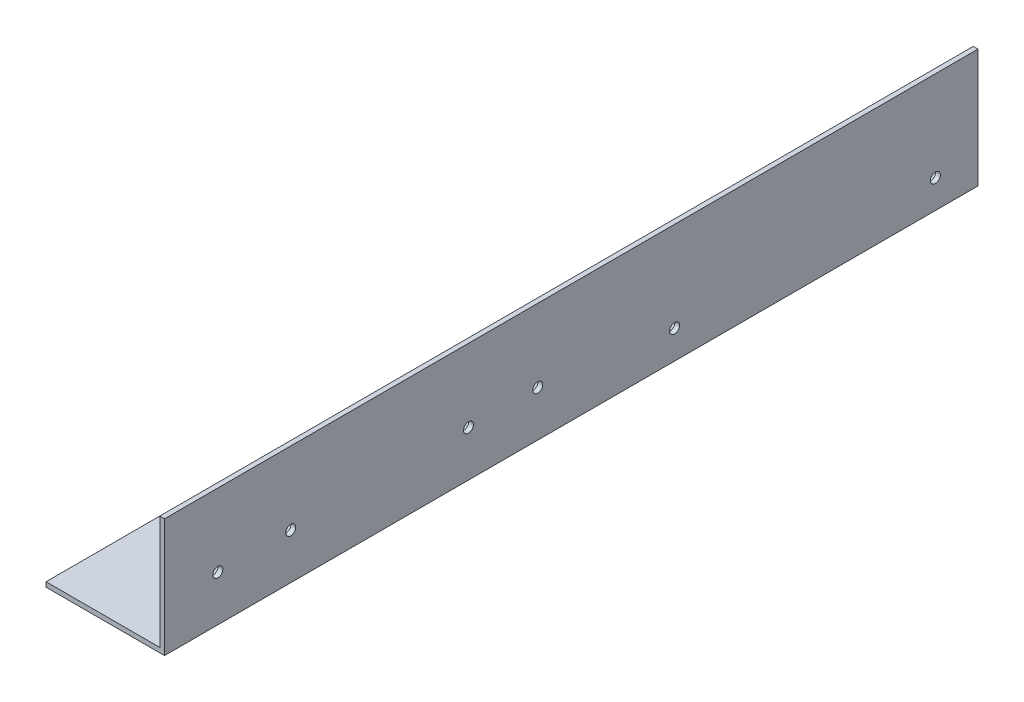
ISO-10303-21;
HEADER;
FILE_DESCRIPTION(('STEP AP214'),'2;1');
FILE_NAME('part.step','',(''),(''),'','','');
FILE_SCHEMA(('AUTOMOTIVE_DESIGN { 1 0 10303 214 1 1 1 1 }'));
ENDSEC;
DATA;
#1=APPLICATION_CONTEXT('core data for automotive mechanical design processes');
#2=APPLICATION_PROTOCOL_DEFINITION('international standard','automotive_design',2000,#1);
#3=PRODUCT_CONTEXT('',#1,'mechanical');
#4=PRODUCT('Part','Part','',(#3));
#5=PRODUCT_RELATED_PRODUCT_CATEGORY('part','',(#4));
#6=PRODUCT_DEFINITION_FORMATION('','',#4);
#7=PRODUCT_DEFINITION_CONTEXT('part definition',#1,'design');
#8=PRODUCT_DEFINITION('design','',#6,#7);
#9=PRODUCT_DEFINITION_SHAPE('','',#8);
#10=(LENGTH_UNIT() NAMED_UNIT(*) SI_UNIT(.MILLI.,.METRE.));
#11=(NAMED_UNIT(*) PLANE_ANGLE_UNIT() SI_UNIT($,.RADIAN.));
#12=(NAMED_UNIT(*) SI_UNIT($,.STERADIAN.) SOLID_ANGLE_UNIT());
#13=UNCERTAINTY_MEASURE_WITH_UNIT(LENGTH_MEASURE(1.E-05),#10,'distance_accuracy_value','');
#14=(GEOMETRIC_REPRESENTATION_CONTEXT(3) GLOBAL_UNCERTAINTY_ASSIGNED_CONTEXT((#13)) GLOBAL_UNIT_ASSIGNED_CONTEXT((#10,
#11,#12)) REPRESENTATION_CONTEXT('',''));
#15=CARTESIAN_POINT('',(0.,0.,0.));
#16=DIRECTION('',(0.,0.,1.));
#17=DIRECTION('',(1.,0.,0.));
#18=AXIS2_PLACEMENT_3D('',#15,#16,#17);
#19=CARTESIAN_POINT('',(0.,50.,343.25));
#20=DIRECTION('',(-1.,0.,0.));
#21=DIRECTION('',(0.,0.,1.));
#22=AXIS2_PLACEMENT_3D('',#19,#20,#21);
#23=PLANE('',#22);
#24=CARTESIAN_POINT('',(0.,12.,18.));
#25=DIRECTION('',(-1.,0.,0.));
#26=DIRECTION('',(0.,0.,1.));
#27=AXIS2_PLACEMENT_3D('',#24,#25,#26);
#28=CIRCLE('',#27,2.1);
#29=CARTESIAN_POINT('',(0.,12.,20.1));
#30=VERTEX_POINT('',#29);
#31=EDGE_CURVE('E144',#30,#30,#28,.T.);
#32=ORIENTED_EDGE('',*,*,#31,.T.);
#33=EDGE_LOOP('',(#32));
#34=FACE_BOUND('',#33,.T.);
#35=CARTESIAN_POINT('',(0.,12.,128.));
#36=DIRECTION('',(-1.,0.,0.));
#37=DIRECTION('',(0.,0.,1.));
#38=AXIS2_PLACEMENT_3D('',#35,#36,#37);
#39=CIRCLE('',#38,2.09999999999999);
#40=CARTESIAN_POINT('',(0.,12.,130.1));
#41=VERTEX_POINT('',#40);
#42=EDGE_CURVE('E159',#41,#41,#39,.T.);
#43=ORIENTED_EDGE('',*,*,#42,.T.);
#44=EDGE_LOOP('',(#43));
#45=FACE_BOUND('',#44,.T.);
#46=CARTESIAN_POINT('',(0.,19.25,185.75));
#47=DIRECTION('',(-1.,0.,0.));
#48=DIRECTION('',(0.,0.,1.));
#49=AXIS2_PLACEMENT_3D('',#46,#47,#48);
#50=CIRCLE('',#49,2.09999999999999);
#51=CARTESIAN_POINT('',(0.,19.25,187.85));
#52=VERTEX_POINT('',#51);
#53=EDGE_CURVE('E127',#52,#52,#50,.T.);
#54=ORIENTED_EDGE('',*,*,#53,.T.);
#55=EDGE_LOOP('',(#54));
#56=FACE_BOUND('',#55,.T.);
#57=CARTESIAN_POINT('',(0.,19.25,215.));
#58=DIRECTION('',(-1.,0.,0.));
#59=DIRECTION('',(0.,0.,1.));
#60=AXIS2_PLACEMENT_3D('',#57,#58,#59);
#61=CIRCLE('',#60,2.09999999999999);
#62=CARTESIAN_POINT('',(0.,19.25,217.1));
#63=VERTEX_POINT('',#62);
#64=EDGE_CURVE('E152',#63,#63,#61,.T.);
#65=ORIENTED_EDGE('',*,*,#64,.T.);
#66=EDGE_LOOP('',(#65));
#67=FACE_BOUND('',#66,.T.);
#68=CARTESIAN_POINT('',(0.,19.25,290.));
#69=DIRECTION('',(-1.,0.,0.));
#70=DIRECTION('',(0.,0.,1.));
#71=AXIS2_PLACEMENT_3D('',#68,#69,#70);
#72=CIRCLE('',#71,2.09999999999999);
#73=CARTESIAN_POINT('',(0.,19.25,292.1));
#74=VERTEX_POINT('',#73);
#75=EDGE_CURVE('E148',#74,#74,#72,.T.);
#76=ORIENTED_EDGE('',*,*,#75,.T.);
#77=EDGE_LOOP('',(#76));
#78=FACE_BOUND('',#77,.T.);
#79=CARTESIAN_POINT('',(0.,19.25,320.75));
#80=DIRECTION('',(-1.,0.,0.));
#81=DIRECTION('',(0.,0.,1.));
#82=AXIS2_PLACEMENT_3D('',#79,#80,#81);
#83=CIRCLE('',#82,2.09999999999999);
#84=CARTESIAN_POINT('',(0.,19.25,322.85));
#85=VERTEX_POINT('',#84);
#86=EDGE_CURVE('E143',#85,#85,#83,.T.);
#87=ORIENTED_EDGE('',*,*,#86,.T.);
#88=EDGE_LOOP('',(#87));
#89=FACE_BOUND('',#88,.T.);
#90=DIRECTION('',(0.,1.,0.));
#91=VECTOR('',#90,1.);
#92=CARTESIAN_POINT('',(0.,50.,0.));
#93=LINE('',#92,#91);
#94=CARTESIAN_POINT('',(0.,0.,0.));
#95=VERTEX_POINT('',#94);
#96=CARTESIAN_POINT('',(0.,50.,0.));
#97=VERTEX_POINT('',#96);
#98=EDGE_CURVE('E123',#95,#97,#93,.T.);
#99=ORIENTED_EDGE('',*,*,#98,.T.);
#100=DIRECTION('',(0.,0.,-1.));
#101=VECTOR('',#100,1.);
#102=CARTESIAN_POINT('',(0.,50.,343.25));
#103=LINE('',#102,#101);
#104=CARTESIAN_POINT('',(0.,50.,343.25));
#105=VERTEX_POINT('',#104);
#106=EDGE_CURVE('E11',#105,#97,#103,.T.);
#107=ORIENTED_EDGE('',*,*,#106,.F.);
#108=DIRECTION('',(0.,1.,0.));
#109=VECTOR('',#108,1.);
#110=CARTESIAN_POINT('',(0.,50.,343.25));
#111=LINE('',#110,#109);
#112=CARTESIAN_POINT('',(0.,0.,343.25));
#113=VERTEX_POINT('',#112);
#114=EDGE_CURVE('E134',#113,#105,#111,.T.);
#115=ORIENTED_EDGE('',*,*,#114,.F.);
#116=DIRECTION('',(0.,0.,-1.));
#117=VECTOR('',#116,1.);
#118=CARTESIAN_POINT('',(0.,0.,343.25));
#119=LINE('',#118,#117);
#120=EDGE_CURVE('E119',#113,#95,#119,.T.);
#121=ORIENTED_EDGE('',*,*,#120,.T.);
#122=EDGE_LOOP('',(#99,#107,#115,#121));
#123=FACE_BOUND('',#122,.T.);
#124=ADVANCED_FACE('F37',(#34,#45,#56,#67,#78,#89,#123),#23,.F.);
#125=CARTESIAN_POINT('',(-2.,50.,343.25));
#126=DIRECTION('',(0.,-1.,0.));
#127=DIRECTION('',(0.,0.,-1.));
#128=AXIS2_PLACEMENT_3D('',#125,#126,#127);
#129=PLANE('',#128);
#130=DIRECTION('',(-1.,0.,0.));
#131=VECTOR('',#130,1.);
#132=CARTESIAN_POINT('',(-2.,50.,0.));
#133=LINE('',#132,#131);
#134=CARTESIAN_POINT('',(-2.,50.,0.));
#135=VERTEX_POINT('',#134);
#136=EDGE_CURVE('E126',#97,#135,#133,.T.);
#137=ORIENTED_EDGE('',*,*,#136,.T.);
#138=DIRECTION('',(0.,0.,-1.));
#139=VECTOR('',#138,1.);
#140=CARTESIAN_POINT('',(-2.,50.,343.25));
#141=LINE('',#140,#139);
#142=CARTESIAN_POINT('',(-2.,50.,343.25));
#143=VERTEX_POINT('',#142);
#144=EDGE_CURVE('E46',#143,#135,#141,.T.);
#145=ORIENTED_EDGE('',*,*,#144,.F.);
#146=DIRECTION('',(-1.,0.,0.));
#147=VECTOR('',#146,1.);
#148=CARTESIAN_POINT('',(-2.,50.,343.25));
#149=LINE('',#148,#147);
#150=EDGE_CURVE('E92',#105,#143,#149,.T.);
#151=ORIENTED_EDGE('',*,*,#150,.F.);
#152=ORIENTED_EDGE('',*,*,#106,.T.);
#153=EDGE_LOOP('',(#137,#145,#151,#152));
#154=FACE_BOUND('',#153,.T.);
#155=ADVANCED_FACE('F191',(#154),#129,.F.);
#156=CARTESIAN_POINT('',(-2.,2.,343.25));
#157=DIRECTION('',(1.,0.,0.));
#158=DIRECTION('',(0.,0.,-1.));
#159=AXIS2_PLACEMENT_3D('',#156,#157,#158);
#160=PLANE('',#159);
#161=CARTESIAN_POINT('',(-2.,12.,18.));
#162=DIRECTION('',(1.,0.,0.));
#163=DIRECTION('',(0.,0.,-1.));
#164=AXIS2_PLACEMENT_3D('',#161,#162,#163);
#165=CIRCLE('',#164,2.1);
#166=CARTESIAN_POINT('',(-2.,12.,15.9));
#167=VERTEX_POINT('',#166);
#168=EDGE_CURVE('E161',#167,#167,#165,.T.);
#169=ORIENTED_EDGE('',*,*,#168,.T.);
#170=EDGE_LOOP('',(#169));
#171=FACE_BOUND('',#170,.T.);
#172=CARTESIAN_POINT('',(-2.,12.,128.));
#173=DIRECTION('',(1.,0.,0.));
#174=DIRECTION('',(0.,0.,-1.));
#175=AXIS2_PLACEMENT_3D('',#172,#173,#174);
#176=CIRCLE('',#175,2.09999999999999);
#177=CARTESIAN_POINT('',(-2.,12.,125.9));
#178=VERTEX_POINT('',#177);
#179=EDGE_CURVE('E156',#178,#178,#176,.T.);
#180=ORIENTED_EDGE('',*,*,#179,.T.);
#181=EDGE_LOOP('',(#180));
#182=FACE_BOUND('',#181,.T.);
#183=CARTESIAN_POINT('',(-2.,19.25,185.75));
#184=DIRECTION('',(1.,0.,0.));
#185=DIRECTION('',(0.,0.,-1.));
#186=AXIS2_PLACEMENT_3D('',#183,#184,#185);
#187=CIRCLE('',#186,2.09999999999999);
#188=CARTESIAN_POINT('',(-2.,19.25,183.65));
#189=VERTEX_POINT('',#188);
#190=EDGE_CURVE('E153',#189,#189,#187,.T.);
#191=ORIENTED_EDGE('',*,*,#190,.T.);
#192=EDGE_LOOP('',(#191));
#193=FACE_BOUND('',#192,.T.);
#194=CARTESIAN_POINT('',(-2.,19.25,215.));
#195=DIRECTION('',(1.,0.,0.));
#196=DIRECTION('',(0.,0.,-1.));
#197=AXIS2_PLACEMENT_3D('',#194,#195,#196);
#198=CIRCLE('',#197,2.09999999999999);
#199=CARTESIAN_POINT('',(-2.,19.25,212.9));
#200=VERTEX_POINT('',#199);
#201=EDGE_CURVE('E149',#200,#200,#198,.T.);
#202=ORIENTED_EDGE('',*,*,#201,.T.);
#203=EDGE_LOOP('',(#202));
#204=FACE_BOUND('',#203,.T.);
#205=CARTESIAN_POINT('',(-2.,19.25,290.));
#206=DIRECTION('',(1.,0.,0.));
#207=DIRECTION('',(0.,0.,-1.));
#208=AXIS2_PLACEMENT_3D('',#205,#206,#207);
#209=CIRCLE('',#208,2.09999999999999);
#210=CARTESIAN_POINT('',(-2.,19.25,287.9));
#211=VERTEX_POINT('',#210);
#212=EDGE_CURVE('E145',#211,#211,#209,.T.);
#213=ORIENTED_EDGE('',*,*,#212,.T.);
#214=EDGE_LOOP('',(#213));
#215=FACE_BOUND('',#214,.T.);
#216=CARTESIAN_POINT('',(-2.,19.25,320.75));
#217=DIRECTION('',(1.,0.,0.));
#218=DIRECTION('',(0.,0.,-1.));
#219=AXIS2_PLACEMENT_3D('',#216,#217,#218);
#220=CIRCLE('',#219,2.09999999999999);
#221=CARTESIAN_POINT('',(-2.,19.25,318.65));
#222=VERTEX_POINT('',#221);
#223=EDGE_CURVE('E140',#222,#222,#220,.T.);
#224=ORIENTED_EDGE('',*,*,#223,.T.);
#225=EDGE_LOOP('',(#224));
#226=FACE_BOUND('',#225,.T.);
#227=DIRECTION('',(0.,-1.,0.));
#228=VECTOR('',#227,1.);
#229=CARTESIAN_POINT('',(-2.,2.,0.));
#230=LINE('',#229,#228);
#231=CARTESIAN_POINT('',(-2.,2.,0.));
#232=VERTEX_POINT('',#231);
#233=EDGE_CURVE('E129',#135,#232,#230,.T.);
#234=ORIENTED_EDGE('',*,*,#233,.T.);
#235=DIRECTION('',(0.,0.,-1.));
#236=VECTOR('',#235,1.);
#237=CARTESIAN_POINT('',(-2.,2.,343.25));
#238=LINE('',#237,#236);
#239=CARTESIAN_POINT('',(-2.,2.,343.25));
#240=VERTEX_POINT('',#239);
#241=EDGE_CURVE('E114',#240,#232,#238,.T.);
#242=ORIENTED_EDGE('',*,*,#241,.F.);
#243=DIRECTION('',(0.,-1.,0.));
#244=VECTOR('',#243,1.);
#245=CARTESIAN_POINT('',(-2.,2.,343.25));
#246=LINE('',#245,#244);
#247=EDGE_CURVE('E105',#143,#240,#246,.T.);
#248=ORIENTED_EDGE('',*,*,#247,.F.);
#249=ORIENTED_EDGE('',*,*,#144,.T.);
#250=EDGE_LOOP('',(#234,#242,#248,#249));
#251=FACE_BOUND('',#250,.T.);
#252=ADVANCED_FACE('F194',(#171,#182,#193,#204,#215,#226,#251),#160,.F.);
#253=CARTESIAN_POINT('',(-50.,2.,343.25));
#254=DIRECTION('',(0.,-1.,0.));
#255=DIRECTION('',(0.,0.,-1.));
#256=AXIS2_PLACEMENT_3D('',#253,#254,#255);
#257=PLANE('',#256);
#258=CARTESIAN_POINT('',(-25.,2.,12.5));
#259=DIRECTION('',(0.,-1.,0.));
#260=DIRECTION('',(0.,0.,-1.));
#261=AXIS2_PLACEMENT_3D('',#258,#259,#260);
#262=CIRCLE('',#261,2.75);
#263=CARTESIAN_POINT('',(-25.,2.,9.75));
#264=VERTEX_POINT('',#263);
#265=EDGE_CURVE('E160',#264,#264,#262,.T.);
#266=ORIENTED_EDGE('',*,*,#265,.T.);
#267=EDGE_LOOP('',(#266));
#268=FACE_BOUND('',#267,.T.);
#269=CARTESIAN_POINT('',(-25.,2.,37.5));
#270=DIRECTION('',(0.,-1.,0.));
#271=DIRECTION('',(0.,0.,-1.));
#272=AXIS2_PLACEMENT_3D('',#269,#270,#271);
#273=CIRCLE('',#272,2.75);
#274=CARTESIAN_POINT('',(-25.,2.,34.75));
#275=VERTEX_POINT('',#274);
#276=EDGE_CURVE('E165',#275,#275,#273,.T.);
#277=ORIENTED_EDGE('',*,*,#276,.T.);
#278=EDGE_LOOP('',(#277));
#279=FACE_BOUND('',#278,.T.);
#280=DIRECTION('',(-1.,0.,0.));
#281=VECTOR('',#280,1.);
#282=CARTESIAN_POINT('',(-50.,2.,0.));
#283=LINE('',#282,#281);
#284=CARTESIAN_POINT('',(-50.,2.,0.));
#285=VERTEX_POINT('',#284);
#286=EDGE_CURVE('E113',#232,#285,#283,.T.);
#287=ORIENTED_EDGE('',*,*,#286,.T.);
#288=DIRECTION('',(0.,0.,-1.));
#289=VECTOR('',#288,1.);
#290=CARTESIAN_POINT('',(-50.,2.,343.25));
#291=LINE('',#290,#289);
#292=CARTESIAN_POINT('',(-50.,2.,343.25));
#293=VERTEX_POINT('',#292);
#294=EDGE_CURVE('E110',#293,#285,#291,.T.);
#295=ORIENTED_EDGE('',*,*,#294,.F.);
#296=DIRECTION('',(-1.,0.,0.));
#297=VECTOR('',#296,1.);
#298=CARTESIAN_POINT('',(-50.,2.,343.25));
#299=LINE('',#298,#297);
#300=EDGE_CURVE('E99',#240,#293,#299,.T.);
#301=ORIENTED_EDGE('',*,*,#300,.F.);
#302=ORIENTED_EDGE('',*,*,#241,.T.);
#303=EDGE_LOOP('',(#287,#295,#301,#302));
#304=FACE_BOUND('',#303,.T.);
#305=ADVANCED_FACE('F111',(#268,#279,#304),#257,.F.);
#306=CARTESIAN_POINT('',(-50.,0.,343.25));
#307=DIRECTION('',(1.,0.,0.));
#308=DIRECTION('',(0.,0.,-1.));
#309=AXIS2_PLACEMENT_3D('',#306,#307,#308);
#310=PLANE('',#309);
#311=DIRECTION('',(0.,-1.,0.));
#312=VECTOR('',#311,1.);
#313=CARTESIAN_POINT('',(-50.,0.,0.));
#314=LINE('',#313,#312);
#315=CARTESIAN_POINT('',(-50.,0.,0.));
#316=VERTEX_POINT('',#315);
#317=EDGE_CURVE('E78',#285,#316,#314,.T.);
#318=ORIENTED_EDGE('',*,*,#317,.T.);
#319=DIRECTION('',(0.,0.,-1.));
#320=VECTOR('',#319,1.);
#321=CARTESIAN_POINT('',(-50.,0.,343.25));
#322=LINE('',#321,#320);
#323=CARTESIAN_POINT('',(-50.,0.,343.25));
#324=VERTEX_POINT('',#323);
#325=EDGE_CURVE('E115',#324,#316,#322,.T.);
#326=ORIENTED_EDGE('',*,*,#325,.F.);
#327=DIRECTION('',(0.,-1.,0.));
#328=VECTOR('',#327,1.);
#329=CARTESIAN_POINT('',(-50.,0.,343.25));
#330=LINE('',#329,#328);
#331=EDGE_CURVE('E103',#293,#324,#330,.T.);
#332=ORIENTED_EDGE('',*,*,#331,.F.);
#333=ORIENTED_EDGE('',*,*,#294,.T.);
#334=EDGE_LOOP('',(#318,#326,#332,#333));
#335=FACE_BOUND('',#334,.T.);
#336=ADVANCED_FACE('F117',(#335),#310,.F.);
#337=CARTESIAN_POINT('',(0.,0.,343.25));
#338=DIRECTION('',(0.,1.,0.));
#339=DIRECTION('',(0.,0.,1.));
#340=AXIS2_PLACEMENT_3D('',#337,#338,#339);
#341=PLANE('',#340);
#342=CARTESIAN_POINT('',(-25.,0.,12.5));
#343=DIRECTION('',(0.,1.,0.));
#344=DIRECTION('',(0.,0.,1.));
#345=AXIS2_PLACEMENT_3D('',#342,#343,#344);
#346=CIRCLE('',#345,2.75);
#347=CARTESIAN_POINT('',(-25.,0.,15.25));
#348=VERTEX_POINT('',#347);
#349=EDGE_CURVE('E40',#348,#348,#346,.T.);
#350=ORIENTED_EDGE('',*,*,#349,.T.);
#351=EDGE_LOOP('',(#350));
#352=FACE_BOUND('',#351,.T.);
#353=CARTESIAN_POINT('',(-25.,0.,37.5));
#354=DIRECTION('',(0.,1.,0.));
#355=DIRECTION('',(0.,0.,1.));
#356=AXIS2_PLACEMENT_3D('',#353,#354,#355);
#357=CIRCLE('',#356,2.75);
#358=CARTESIAN_POINT('',(-25.,0.,40.25));
#359=VERTEX_POINT('',#358);
#360=EDGE_CURVE('E163',#359,#359,#357,.T.);
#361=ORIENTED_EDGE('',*,*,#360,.T.);
#362=EDGE_LOOP('',(#361));
#363=FACE_BOUND('',#362,.T.);
#364=DIRECTION('',(1.,0.,0.));
#365=VECTOR('',#364,1.);
#366=CARTESIAN_POINT('',(0.,0.,0.));
#367=LINE('',#366,#365);
#368=EDGE_CURVE('E84',#316,#95,#367,.T.);
#369=ORIENTED_EDGE('',*,*,#368,.T.);
#370=ORIENTED_EDGE('',*,*,#120,.F.);
#371=DIRECTION('',(1.,0.,0.));
#372=VECTOR('',#371,1.);
#373=CARTESIAN_POINT('',(0.,0.,343.25));
#374=LINE('',#373,#372);
#375=EDGE_CURVE('E55',#324,#113,#374,.T.);
#376=ORIENTED_EDGE('',*,*,#375,.F.);
#377=ORIENTED_EDGE('',*,*,#325,.T.);
#378=EDGE_LOOP('',(#369,#370,#376,#377));
#379=FACE_BOUND('',#378,.T.);
#380=ADVANCED_FACE('F199',(#352,#363,#379),#341,.F.);
#381=CARTESIAN_POINT('',(0.,0.,343.25));
#382=DIRECTION('',(0.,0.,-1.));
#383=DIRECTION('',(-1.,0.,0.));
#384=AXIS2_PLACEMENT_3D('',#381,#382,#383);
#385=PLANE('',#384);
#386=ORIENTED_EDGE('',*,*,#114,.T.);
#387=ORIENTED_EDGE('',*,*,#150,.T.);
#388=ORIENTED_EDGE('',*,*,#247,.T.);
#389=ORIENTED_EDGE('',*,*,#300,.T.);
#390=ORIENTED_EDGE('',*,*,#331,.T.);
#391=ORIENTED_EDGE('',*,*,#375,.T.);
#392=EDGE_LOOP('',(#386,#387,#388,#389,#390,#391));
#393=FACE_BOUND('',#392,.T.);
#394=ADVANCED_FACE('F101',(#393),#385,.F.);
#395=CARTESIAN_POINT('',(0.,0.,0.));
#396=DIRECTION('',(0.,0.,-1.));
#397=DIRECTION('',(-1.,0.,0.));
#398=AXIS2_PLACEMENT_3D('',#395,#396,#397);
#399=PLANE('',#398);
#400=ORIENTED_EDGE('',*,*,#98,.F.);
#401=ORIENTED_EDGE('',*,*,#368,.F.);
#402=ORIENTED_EDGE('',*,*,#317,.F.);
#403=ORIENTED_EDGE('',*,*,#286,.F.);
#404=ORIENTED_EDGE('',*,*,#233,.F.);
#405=ORIENTED_EDGE('',*,*,#136,.F.);
#406=EDGE_LOOP('',(#400,#401,#402,#403,#404,#405));
#407=FACE_BOUND('',#406,.T.);
#408=ADVANCED_FACE('F197',(#407),#399,.T.);
#409=CARTESIAN_POINT('',(-5.,19.25,320.75));
#410=DIRECTION('',(1.,0.,0.));
#411=DIRECTION('',(0.,0.,-1.));
#412=AXIS2_PLACEMENT_3D('',#409,#410,#411);
#413=CYLINDRICAL_SURFACE('',#412,2.09999999999999);
#414=ORIENTED_EDGE('',*,*,#223,.F.);
#415=EDGE_LOOP('',(#414));
#416=FACE_BOUND('',#415,.T.);
#417=ORIENTED_EDGE('',*,*,#86,.F.);
#418=EDGE_LOOP('',(#417));
#419=FACE_BOUND('',#418,.T.);
#420=ADVANCED_FACE('F227',(#416,#419),#413,.F.);
#421=CARTESIAN_POINT('',(-5.,19.25,290.));
#422=DIRECTION('',(1.,0.,0.));
#423=DIRECTION('',(0.,0.,-1.));
#424=AXIS2_PLACEMENT_3D('',#421,#422,#423);
#425=CYLINDRICAL_SURFACE('',#424,2.09999999999999);
#426=ORIENTED_EDGE('',*,*,#212,.F.);
#427=EDGE_LOOP('',(#426));
#428=FACE_BOUND('',#427,.T.);
#429=ORIENTED_EDGE('',*,*,#75,.F.);
#430=EDGE_LOOP('',(#429));
#431=FACE_BOUND('',#430,.T.);
#432=ADVANCED_FACE('F229',(#428,#431),#425,.F.);
#433=CARTESIAN_POINT('',(-5.,19.25,215.));
#434=DIRECTION('',(1.,0.,0.));
#435=DIRECTION('',(0.,0.,-1.));
#436=AXIS2_PLACEMENT_3D('',#433,#434,#435);
#437=CYLINDRICAL_SURFACE('',#436,2.09999999999999);
#438=ORIENTED_EDGE('',*,*,#201,.F.);
#439=EDGE_LOOP('',(#438));
#440=FACE_BOUND('',#439,.T.);
#441=ORIENTED_EDGE('',*,*,#64,.F.);
#442=EDGE_LOOP('',(#441));
#443=FACE_BOUND('',#442,.T.);
#444=ADVANCED_FACE('F236',(#440,#443),#437,.F.);
#445=CARTESIAN_POINT('',(-5.,19.25,185.75));
#446=DIRECTION('',(1.,0.,0.));
#447=DIRECTION('',(0.,0.,-1.));
#448=AXIS2_PLACEMENT_3D('',#445,#446,#447);
#449=CYLINDRICAL_SURFACE('',#448,2.09999999999999);
#450=ORIENTED_EDGE('',*,*,#190,.F.);
#451=EDGE_LOOP('',(#450));
#452=FACE_BOUND('',#451,.T.);
#453=ORIENTED_EDGE('',*,*,#53,.F.);
#454=EDGE_LOOP('',(#453));
#455=FACE_BOUND('',#454,.T.);
#456=ADVANCED_FACE('F243',(#452,#455),#449,.F.);
#457=CARTESIAN_POINT('',(-5.,12.,128.));
#458=DIRECTION('',(1.,0.,0.));
#459=DIRECTION('',(0.,0.,-1.));
#460=AXIS2_PLACEMENT_3D('',#457,#458,#459);
#461=CYLINDRICAL_SURFACE('',#460,2.09999999999999);
#462=ORIENTED_EDGE('',*,*,#179,.F.);
#463=EDGE_LOOP('',(#462));
#464=FACE_BOUND('',#463,.T.);
#465=ORIENTED_EDGE('',*,*,#42,.F.);
#466=EDGE_LOOP('',(#465));
#467=FACE_BOUND('',#466,.T.);
#468=ADVANCED_FACE('F247',(#464,#467),#461,.F.);
#469=CARTESIAN_POINT('',(-5.,12.,18.));
#470=DIRECTION('',(1.,0.,0.));
#471=DIRECTION('',(0.,0.,-1.));
#472=AXIS2_PLACEMENT_3D('',#469,#470,#471);
#473=CYLINDRICAL_SURFACE('',#472,2.1);
#474=ORIENTED_EDGE('',*,*,#168,.F.);
#475=EDGE_LOOP('',(#474));
#476=FACE_BOUND('',#475,.T.);
#477=ORIENTED_EDGE('',*,*,#31,.F.);
#478=EDGE_LOOP('',(#477));
#479=FACE_BOUND('',#478,.T.);
#480=ADVANCED_FACE('F251',(#476,#479),#473,.F.);
#481=CARTESIAN_POINT('',(-25.,-5.,37.5));
#482=DIRECTION('',(0.,1.,0.));
#483=DIRECTION('',(0.,0.,1.));
#484=AXIS2_PLACEMENT_3D('',#481,#482,#483);
#485=CYLINDRICAL_SURFACE('',#484,2.75);
#486=ORIENTED_EDGE('',*,*,#360,.F.);
#487=EDGE_LOOP('',(#486));
#488=FACE_BOUND('',#487,.T.);
#489=ORIENTED_EDGE('',*,*,#276,.F.);
#490=EDGE_LOOP('',(#489));
#491=FACE_BOUND('',#490,.T.);
#492=ADVANCED_FACE('F255',(#488,#491),#485,.F.);
#493=CARTESIAN_POINT('',(-25.,-5.,12.5));
#494=DIRECTION('',(0.,1.,0.));
#495=DIRECTION('',(0.,0.,1.));
#496=AXIS2_PLACEMENT_3D('',#493,#494,#495);
#497=CYLINDRICAL_SURFACE('',#496,2.75);
#498=ORIENTED_EDGE('',*,*,#349,.F.);
#499=EDGE_LOOP('',(#498));
#500=FACE_BOUND('',#499,.T.);
#501=ORIENTED_EDGE('',*,*,#265,.F.);
#502=EDGE_LOOP('',(#501));
#503=FACE_BOUND('',#502,.T.);
#504=ADVANCED_FACE('F259',(#500,#503),#497,.F.);
#505=CLOSED_SHELL('',(#124,#155,#252,#305,#336,#380,#394,#408,#420,#432,#444,#456,#468,#480,
#492,#504));
#506=MANIFOLD_SOLID_BREP('B2',#505);
#507=ADVANCED_BREP_SHAPE_REPRESENTATION('',(#18,#506),#14);
#508=SHAPE_DEFINITION_REPRESENTATION(#9,#507);
ENDSEC;
END-ISO-10303-21;
